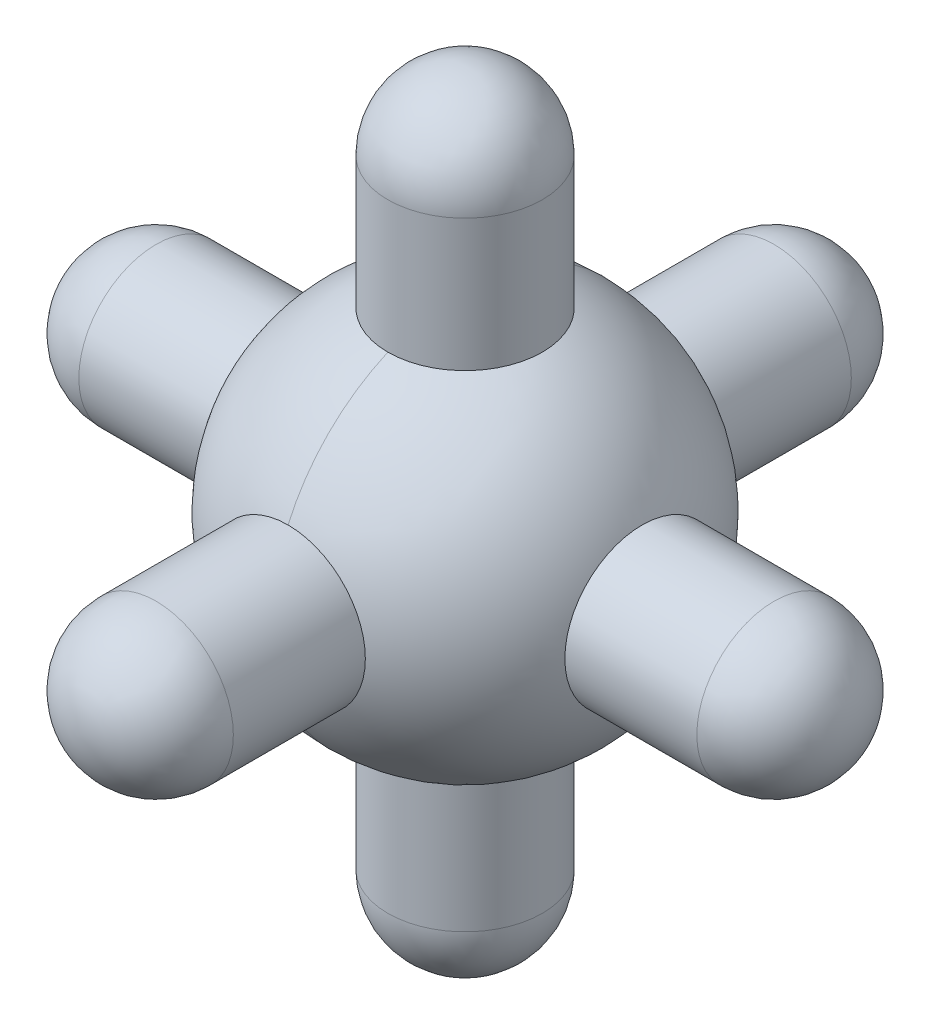
ISO-10303-21;
HEADER;
FILE_DESCRIPTION(('STEP AP214'),'2;1');
FILE_NAME('part.step','',(''),(''),'','','');
FILE_SCHEMA(('AUTOMOTIVE_DESIGN { 1 0 10303 214 1 1 1 1 }'));
ENDSEC;
DATA;
#1=APPLICATION_CONTEXT('core data for automotive mechanical design processes');
#2=APPLICATION_PROTOCOL_DEFINITION('international standard','automotive_design',2000,#1);
#3=PRODUCT_CONTEXT('',#1,'mechanical');
#4=PRODUCT('Part','Part','',(#3));
#5=PRODUCT_RELATED_PRODUCT_CATEGORY('part','',(#4));
#6=PRODUCT_DEFINITION_FORMATION('','',#4);
#7=PRODUCT_DEFINITION_CONTEXT('part definition',#1,'design');
#8=PRODUCT_DEFINITION('design','',#6,#7);
#9=PRODUCT_DEFINITION_SHAPE('','',#8);
#10=(LENGTH_UNIT() NAMED_UNIT(*) SI_UNIT(.MILLI.,.METRE.));
#11=(NAMED_UNIT(*) PLANE_ANGLE_UNIT() SI_UNIT($,.RADIAN.));
#12=(NAMED_UNIT(*) SI_UNIT($,.STERADIAN.) SOLID_ANGLE_UNIT());
#13=UNCERTAINTY_MEASURE_WITH_UNIT(LENGTH_MEASURE(1.E-05),#10,'distance_accuracy_value','');
#14=(GEOMETRIC_REPRESENTATION_CONTEXT(3) GLOBAL_UNCERTAINTY_ASSIGNED_CONTEXT((#13)) GLOBAL_UNIT_ASSIGNED_CONTEXT((#10,
#11,#12)) REPRESENTATION_CONTEXT('',''));
#15=CARTESIAN_POINT('',(0.,0.,0.));
#16=DIRECTION('',(0.,0.,1.));
#17=DIRECTION('',(1.,0.,0.));
#18=AXIS2_PLACEMENT_3D('',#15,#16,#17);
#19=CARTESIAN_POINT('',(0.,0.,0.));
#20=DIRECTION('',(1.,0.,0.));
#21=DIRECTION('',(0.,0.,-1.));
#22=AXIS2_PLACEMENT_3D('',#19,#20,#21);
#23=SPHERICAL_SURFACE('',#22,25.);
#24=CARTESIAN_POINT('',(22.9128784747792,0.,0.));
#25=DIRECTION('',(-1.,0.,0.));
#26=DIRECTION('',(0.,0.,1.));
#27=AXIS2_PLACEMENT_3D('',#24,#25,#26);
#28=CIRCLE('',#27,10.);
#29=CARTESIAN_POINT('',(22.9128784747792,0.,10.));
#30=VERTEX_POINT('',#29);
#31=EDGE_CURVE('E110',#30,#30,#28,.T.);
#32=ORIENTED_EDGE('',*,*,#31,.T.);
#33=EDGE_LOOP('',(#32));
#34=FACE_BOUND('',#33,.T.);
#35=CARTESIAN_POINT('',(0.,0.,0.));
#36=DIRECTION('',(-1.,0.,0.));
#37=DIRECTION('',(0.,0.,1.));
#38=AXIS2_PLACEMENT_3D('',#35,#36,#37);
#39=CIRCLE('',#38,25.);
#40=CARTESIAN_POINT('',(0.,-22.9128784747792,10.));
#41=VERTEX_POINT('',#40);
#42=CARTESIAN_POINT('',(0.,-10.,22.9128784747792));
#43=VERTEX_POINT('',#42);
#44=EDGE_CURVE('E99',#41,#43,#39,.T.);
#45=ORIENTED_EDGE('',*,*,#44,.F.);
#46=CARTESIAN_POINT('',(0.,-22.9128784747792,0.));
#47=DIRECTION('',(0.,1.,0.));
#48=DIRECTION('',(0.,0.,1.));
#49=AXIS2_PLACEMENT_3D('',#46,#47,#48);
#50=CIRCLE('',#49,10.);
#51=CARTESIAN_POINT('',(0.,-22.9128784747792,-10.));
#52=VERTEX_POINT('',#51);
#53=EDGE_CURVE('E52',#41,#52,#50,.T.);
#54=ORIENTED_EDGE('',*,*,#53,.T.);
#55=CARTESIAN_POINT('',(0.,-10.,-22.9128784747792));
#56=VERTEX_POINT('',#55);
#57=EDGE_CURVE('E103',#56,#52,#39,.T.);
#58=ORIENTED_EDGE('',*,*,#57,.F.);
#59=CARTESIAN_POINT('',(0.,0.,-22.9128784747792));
#60=DIRECTION('',(0.,0.,1.));
#61=DIRECTION('',(1.,0.,0.));
#62=AXIS2_PLACEMENT_3D('',#59,#60,#61);
#63=CIRCLE('',#62,10.);
#64=CARTESIAN_POINT('',(0.,10.,-22.9128784747792));
#65=VERTEX_POINT('',#64);
#66=EDGE_CURVE('E115',#56,#65,#63,.T.);
#67=ORIENTED_EDGE('',*,*,#66,.T.);
#68=CARTESIAN_POINT('',(0.,22.9128784747792,-10.));
#69=VERTEX_POINT('',#68);
#70=EDGE_CURVE('E91',#69,#65,#39,.T.);
#71=ORIENTED_EDGE('',*,*,#70,.F.);
#72=CARTESIAN_POINT('',(0.,22.9128784747792,0.));
#73=DIRECTION('',(0.,-1.,0.));
#74=DIRECTION('',(0.,0.,-1.));
#75=AXIS2_PLACEMENT_3D('',#72,#73,#74);
#76=CIRCLE('',#75,10.);
#77=CARTESIAN_POINT('',(0.,22.9128784747792,10.));
#78=VERTEX_POINT('',#77);
#79=EDGE_CURVE('E58',#69,#78,#76,.T.);
#80=ORIENTED_EDGE('',*,*,#79,.T.);
#81=CARTESIAN_POINT('',(0.,10.,22.9128784747792));
#82=VERTEX_POINT('',#81);
#83=EDGE_CURVE('E88',#82,#78,#39,.T.);
#84=ORIENTED_EDGE('',*,*,#83,.F.);
#85=CARTESIAN_POINT('',(0.,0.,22.9128784747792));
#86=DIRECTION('',(0.,0.,-1.));
#87=DIRECTION('',(-1.,0.,0.));
#88=AXIS2_PLACEMENT_3D('',#85,#86,#87);
#89=CIRCLE('',#88,10.);
#90=EDGE_CURVE('E113',#82,#43,#89,.T.);
#91=ORIENTED_EDGE('',*,*,#90,.T.);
#92=EDGE_LOOP('',(#45,#54,#58,#67,#71,#80,#84,#91));
#93=FACE_BOUND('',#92,.T.);
#94=ADVANCED_FACE('F39',(#34,#93),#23,.T.);
#95=CARTESIAN_POINT('',(0.,0.,0.));
#96=DIRECTION('',(1.,0.,0.));
#97=DIRECTION('',(0.,0.,-1.));
#98=AXIS2_PLACEMENT_3D('',#95,#96,#97);
#99=SPHERICAL_SURFACE('',#98,25.);
#100=CARTESIAN_POINT('',(-22.9128784747792,0.,0.));
#101=DIRECTION('',(1.,0.,0.));
#102=DIRECTION('',(0.,0.,-1.));
#103=AXIS2_PLACEMENT_3D('',#100,#101,#102);
#104=CIRCLE('',#103,10.);
#105=CARTESIAN_POINT('',(-22.9128784747792,0.,-10.));
#106=VERTEX_POINT('',#105);
#107=EDGE_CURVE('E120',#106,#106,#104,.T.);
#108=ORIENTED_EDGE('',*,*,#107,.T.);
#109=EDGE_LOOP('',(#108));
#110=FACE_BOUND('',#109,.T.);
#111=ORIENTED_EDGE('',*,*,#57,.T.);
#112=CARTESIAN_POINT('',(0.,-22.9128784747792,0.));
#113=DIRECTION('',(0.,1.,0.));
#114=DIRECTION('',(0.,0.,1.));
#115=AXIS2_PLACEMENT_3D('',#112,#113,#114);
#116=CIRCLE('',#115,10.);
#117=EDGE_CURVE('E85',#52,#41,#116,.T.);
#118=ORIENTED_EDGE('',*,*,#117,.T.);
#119=ORIENTED_EDGE('',*,*,#44,.T.);
#120=CARTESIAN_POINT('',(0.,0.,22.9128784747792));
#121=DIRECTION('',(0.,0.,-1.));
#122=DIRECTION('',(-1.,0.,0.));
#123=AXIS2_PLACEMENT_3D('',#120,#121,#122);
#124=CIRCLE('',#123,10.);
#125=EDGE_CURVE('E97',#43,#82,#124,.T.);
#126=ORIENTED_EDGE('',*,*,#125,.T.);
#127=ORIENTED_EDGE('',*,*,#83,.T.);
#128=CARTESIAN_POINT('',(0.,22.9128784747792,0.));
#129=DIRECTION('',(0.,-1.,0.));
#130=DIRECTION('',(0.,0.,-1.));
#131=AXIS2_PLACEMENT_3D('',#128,#129,#130);
#132=CIRCLE('',#131,10.);
#133=EDGE_CURVE('E80',#78,#69,#132,.T.);
#134=ORIENTED_EDGE('',*,*,#133,.T.);
#135=ORIENTED_EDGE('',*,*,#70,.T.);
#136=CARTESIAN_POINT('',(0.,0.,-22.9128784747792));
#137=DIRECTION('',(0.,0.,1.));
#138=DIRECTION('',(1.,0.,0.));
#139=AXIS2_PLACEMENT_3D('',#136,#137,#138);
#140=CIRCLE('',#139,10.);
#141=EDGE_CURVE('E111',#65,#56,#140,.T.);
#142=ORIENTED_EDGE('',*,*,#141,.T.);
#143=EDGE_LOOP('',(#111,#118,#119,#126,#127,#134,#135,#142));
#144=FACE_BOUND('',#143,.T.);
#145=ADVANCED_FACE('F95',(#110,#144),#99,.T.);
#146=CARTESIAN_POINT('',(50.,0.,0.));
#147=DIRECTION('',(-1.,0.,0.));
#148=DIRECTION('',(0.,0.,1.));
#149=AXIS2_PLACEMENT_3D('',#146,#147,#148);
#150=CYLINDRICAL_SURFACE('',#149,10.);
#151=CARTESIAN_POINT('',(40.,0.,0.));
#152=DIRECTION('',(-1.,0.,0.));
#153=DIRECTION('',(0.,0.,1.));
#154=AXIS2_PLACEMENT_3D('',#151,#152,#153);
#155=CIRCLE('',#154,10.);
#156=CARTESIAN_POINT('',(40.,0.,10.));
#157=VERTEX_POINT('',#156);
#158=EDGE_CURVE('E101',#157,#157,#155,.T.);
#159=ORIENTED_EDGE('',*,*,#158,.T.);
#160=EDGE_LOOP('',(#159));
#161=FACE_BOUND('',#160,.T.);
#162=ORIENTED_EDGE('',*,*,#31,.F.);
#163=EDGE_LOOP('',(#162));
#164=FACE_BOUND('',#163,.T.);
#165=ADVANCED_FACE('F153',(#161,#164),#150,.T.);
#166=CARTESIAN_POINT('',(-40.,0.,0.));
#167=DIRECTION('',(-1.,0.,0.));
#168=DIRECTION('',(0.,0.,1.));
#169=AXIS2_PLACEMENT_3D('',#166,#167,#168);
#170=CIRCLE('',#169,10.);
#171=CARTESIAN_POINT('',(-40.,0.,10.));
#172=VERTEX_POINT('',#171);
#173=EDGE_CURVE('E96',#172,#172,#170,.F.);
#174=ORIENTED_EDGE('',*,*,#173,.T.);
#175=EDGE_LOOP('',(#174));
#176=FACE_BOUND('',#175,.T.);
#177=ORIENTED_EDGE('',*,*,#107,.F.);
#178=EDGE_LOOP('',(#177));
#179=FACE_BOUND('',#178,.T.);
#180=ADVANCED_FACE('F162',(#176,#179),#150,.T.);
#181=CARTESIAN_POINT('',(-40.,0.,0.));
#182=DIRECTION('',(1.,0.,0.));
#183=DIRECTION('',(0.,0.,-1.));
#184=AXIS2_PLACEMENT_3D('',#181,#182,#183);
#185=SPHERICAL_SURFACE('',#184,10.);
#186=ORIENTED_EDGE('',*,*,#173,.F.);
#187=EDGE_LOOP('',(#186));
#188=FACE_BOUND('',#187,.T.);
#189=ADVANCED_FACE('F159',(#188),#185,.T.);
#190=CARTESIAN_POINT('',(40.,0.,0.));
#191=DIRECTION('',(1.,0.,0.));
#192=DIRECTION('',(0.,0.,-1.));
#193=AXIS2_PLACEMENT_3D('',#190,#191,#192);
#194=SPHERICAL_SURFACE('',#193,10.);
#195=ORIENTED_EDGE('',*,*,#158,.F.);
#196=EDGE_LOOP('',(#195));
#197=FACE_BOUND('',#196,.T.);
#198=ADVANCED_FACE('F163',(#197),#194,.T.);
#199=CARTESIAN_POINT('',(0.,0.,50.));
#200=DIRECTION('',(0.,0.,-1.));
#201=DIRECTION('',(-1.,0.,0.));
#202=AXIS2_PLACEMENT_3D('',#199,#200,#201);
#203=CYLINDRICAL_SURFACE('',#202,10.);
#204=CARTESIAN_POINT('',(0.,0.,40.));
#205=DIRECTION('',(0.,0.,-1.));
#206=DIRECTION('',(-1.,0.,0.));
#207=AXIS2_PLACEMENT_3D('',#204,#205,#206);
#208=CIRCLE('',#207,10.);
#209=CARTESIAN_POINT('',(-10.,0.,40.));
#210=VERTEX_POINT('',#209);
#211=EDGE_CURVE('E84',#210,#210,#208,.T.);
#212=ORIENTED_EDGE('',*,*,#211,.T.);
#213=EDGE_LOOP('',(#212));
#214=FACE_BOUND('',#213,.T.);
#215=ORIENTED_EDGE('',*,*,#90,.F.);
#216=ORIENTED_EDGE('',*,*,#125,.F.);
#217=EDGE_LOOP('',(#215,#216));
#218=FACE_BOUND('',#217,.T.);
#219=ADVANCED_FACE('F168',(#214,#218),#203,.T.);
#220=CARTESIAN_POINT('',(0.,0.,-40.));
#221=DIRECTION('',(0.,0.,-1.));
#222=DIRECTION('',(-1.,0.,0.));
#223=AXIS2_PLACEMENT_3D('',#220,#221,#222);
#224=CIRCLE('',#223,10.);
#225=CARTESIAN_POINT('',(-10.,0.,-40.));
#226=VERTEX_POINT('',#225);
#227=EDGE_CURVE('E126',#226,#226,#224,.F.);
#228=ORIENTED_EDGE('',*,*,#227,.T.);
#229=EDGE_LOOP('',(#228));
#230=FACE_BOUND('',#229,.T.);
#231=ORIENTED_EDGE('',*,*,#66,.F.);
#232=ORIENTED_EDGE('',*,*,#141,.F.);
#233=EDGE_LOOP('',(#231,#232));
#234=FACE_BOUND('',#233,.T.);
#235=ADVANCED_FACE('F171',(#230,#234),#203,.T.);
#236=CARTESIAN_POINT('',(0.,0.,-40.));
#237=DIRECTION('',(0.,0.,1.));
#238=DIRECTION('',(1.,0.,0.));
#239=AXIS2_PLACEMENT_3D('',#236,#237,#238);
#240=SPHERICAL_SURFACE('',#239,10.);
#241=ORIENTED_EDGE('',*,*,#227,.F.);
#242=EDGE_LOOP('',(#241));
#243=FACE_BOUND('',#242,.T.);
#244=ADVANCED_FACE('F166',(#243),#240,.T.);
#245=CARTESIAN_POINT('',(0.,0.,40.));
#246=DIRECTION('',(0.,0.,1.));
#247=DIRECTION('',(1.,0.,0.));
#248=AXIS2_PLACEMENT_3D('',#245,#246,#247);
#249=SPHERICAL_SURFACE('',#248,10.);
#250=ORIENTED_EDGE('',*,*,#211,.F.);
#251=EDGE_LOOP('',(#250));
#252=FACE_BOUND('',#251,.T.);
#253=ADVANCED_FACE('F167',(#252),#249,.T.);
#254=CARTESIAN_POINT('',(0.,50.,0.));
#255=DIRECTION('',(0.,-1.,0.));
#256=DIRECTION('',(0.,0.,-1.));
#257=AXIS2_PLACEMENT_3D('',#254,#255,#256);
#258=CYLINDRICAL_SURFACE('',#257,10.);
#259=CARTESIAN_POINT('',(0.,40.,0.));
#260=DIRECTION('',(0.,-1.,0.));
#261=DIRECTION('',(0.,0.,-1.));
#262=AXIS2_PLACEMENT_3D('',#259,#260,#261);
#263=CIRCLE('',#262,10.);
#264=CARTESIAN_POINT('',(0.,40.,-10.));
#265=VERTEX_POINT('',#264);
#266=EDGE_CURVE('E11',#265,#265,#263,.T.);
#267=ORIENTED_EDGE('',*,*,#266,.T.);
#268=EDGE_LOOP('',(#267));
#269=FACE_BOUND('',#268,.T.);
#270=ORIENTED_EDGE('',*,*,#79,.F.);
#271=ORIENTED_EDGE('',*,*,#133,.F.);
#272=EDGE_LOOP('',(#270,#271));
#273=FACE_BOUND('',#272,.T.);
#274=ADVANCED_FACE('F76',(#269,#273),#258,.T.);
#275=CARTESIAN_POINT('',(0.,-40.,0.));
#276=DIRECTION('',(0.,-1.,0.));
#277=DIRECTION('',(0.,0.,-1.));
#278=AXIS2_PLACEMENT_3D('',#275,#276,#277);
#279=CIRCLE('',#278,10.);
#280=CARTESIAN_POINT('',(0.,-40.,-10.));
#281=VERTEX_POINT('',#280);
#282=EDGE_CURVE('E50',#281,#281,#279,.F.);
#283=ORIENTED_EDGE('',*,*,#282,.T.);
#284=EDGE_LOOP('',(#283));
#285=FACE_BOUND('',#284,.T.);
#286=ORIENTED_EDGE('',*,*,#53,.F.);
#287=ORIENTED_EDGE('',*,*,#117,.F.);
#288=EDGE_LOOP('',(#286,#287));
#289=FACE_BOUND('',#288,.T.);
#290=ADVANCED_FACE('F137',(#285,#289),#258,.T.);
#291=CARTESIAN_POINT('',(0.,-40.,0.));
#292=DIRECTION('',(0.,1.,0.));
#293=DIRECTION('',(0.,0.,1.));
#294=AXIS2_PLACEMENT_3D('',#291,#292,#293);
#295=SPHERICAL_SURFACE('',#294,10.);
#296=ORIENTED_EDGE('',*,*,#282,.F.);
#297=EDGE_LOOP('',(#296));
#298=FACE_BOUND('',#297,.T.);
#299=ADVANCED_FACE('F138',(#298),#295,.T.);
#300=CARTESIAN_POINT('',(0.,40.,0.));
#301=DIRECTION('',(0.,1.,0.));
#302=DIRECTION('',(0.,0.,1.));
#303=AXIS2_PLACEMENT_3D('',#300,#301,#302);
#304=SPHERICAL_SURFACE('',#303,10.);
#305=ORIENTED_EDGE('',*,*,#266,.F.);
#306=EDGE_LOOP('',(#305));
#307=FACE_BOUND('',#306,.T.);
#308=ADVANCED_FACE('F41',(#307),#304,.T.);
#309=CLOSED_SHELL('',(#94,#145,#165,#180,#189,#198,#219,#235,#244,#253,#274,#290,#299,#308));
#310=MANIFOLD_SOLID_BREP('B2',#309);
#311=ADVANCED_BREP_SHAPE_REPRESENTATION('',(#18,#310),#14);
#312=SHAPE_DEFINITION_REPRESENTATION(#9,#311);
ENDSEC;
END-ISO-10303-21;
